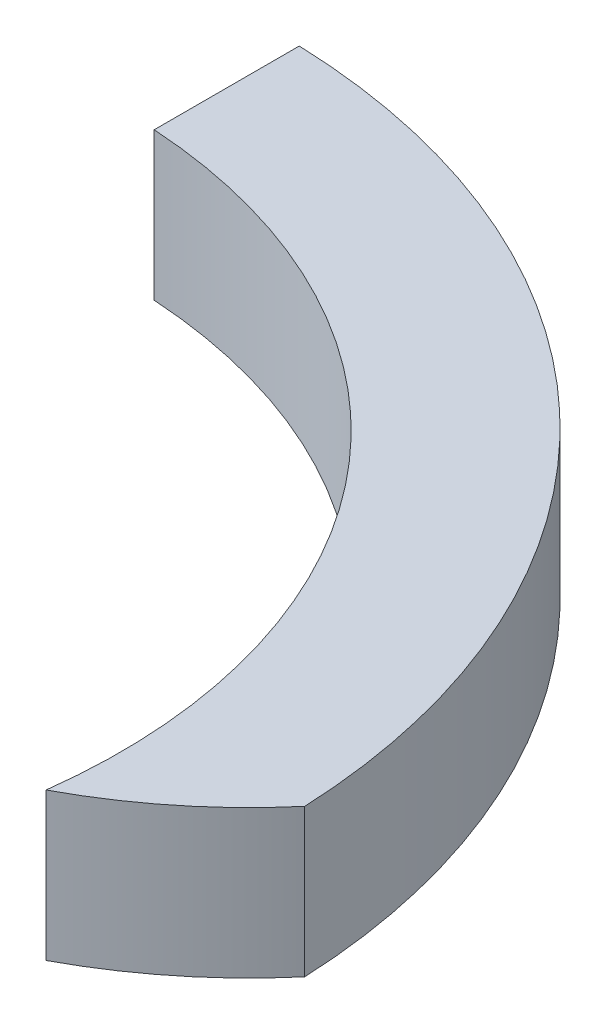
ISO-10303-21;
HEADER;
FILE_DESCRIPTION(('STEP AP214'),'2;1');
FILE_NAME('part.step','',(''),(''),'','','');
FILE_SCHEMA(('AUTOMOTIVE_DESIGN { 1 0 10303 214 1 1 1 1 }'));
ENDSEC;
DATA;
#1=APPLICATION_CONTEXT('core data for automotive mechanical design processes');
#2=APPLICATION_PROTOCOL_DEFINITION('international standard','automotive_design',2000,#1);
#3=PRODUCT_CONTEXT('',#1,'mechanical');
#4=PRODUCT('Part','Part','',(#3));
#5=PRODUCT_RELATED_PRODUCT_CATEGORY('part','',(#4));
#6=PRODUCT_DEFINITION_FORMATION('','',#4);
#7=PRODUCT_DEFINITION_CONTEXT('part definition',#1,'design');
#8=PRODUCT_DEFINITION('design','',#6,#7);
#9=PRODUCT_DEFINITION_SHAPE('','',#8);
#10=(LENGTH_UNIT() NAMED_UNIT(*) SI_UNIT(.MILLI.,.METRE.));
#11=(NAMED_UNIT(*) PLANE_ANGLE_UNIT() SI_UNIT($,.RADIAN.));
#12=(NAMED_UNIT(*) SI_UNIT($,.STERADIAN.) SOLID_ANGLE_UNIT());
#13=UNCERTAINTY_MEASURE_WITH_UNIT(LENGTH_MEASURE(1.E-05),#10,'distance_accuracy_value','');
#14=(GEOMETRIC_REPRESENTATION_CONTEXT(3) GLOBAL_UNCERTAINTY_ASSIGNED_CONTEXT((#13)) GLOBAL_UNIT_ASSIGNED_CONTEXT((#10,
#11,#12)) REPRESENTATION_CONTEXT('',''));
#15=CARTESIAN_POINT('',(0.,0.,0.));
#16=DIRECTION('',(0.,0.,1.));
#17=DIRECTION('',(1.,0.,0.));
#18=AXIS2_PLACEMENT_3D('',#15,#16,#17);
#19=CARTESIAN_POINT('',(86.487166974426,25.4,-86.7884043944306));
#20=DIRECTION('',(0.,1.,0.));
#21=DIRECTION('',(0.,0.,1.));
#22=AXIS2_PLACEMENT_3D('',#19,#20,#21);
#23=PLANE('',#22);
#24=CARTESIAN_POINT('',(18.985182842922,25.4,-43.2164154029401));
#25=DIRECTION('',(0.,1.,0.));
#26=DIRECTION('',(0.,0.,-1.));
#27=AXIS2_PLACEMENT_3D('',#24,#25,#26);
#28=CIRCLE('',#27,117.865599722059);
#29=CARTESIAN_POINT('',(136.744902109116,25.4,-48.2112243269925));
#30=VERTEX_POINT('',#29);
#31=CARTESIAN_POINT('',(23.0118290964539,25.4,-161.013213822038));
#32=VERTEX_POINT('',#31);
#33=EDGE_CURVE('E91',#30,#32,#28,.T.);
#34=ORIENTED_EDGE('',*,*,#33,.T.);
#35=DIRECTION('',(0.,0.,1.));
#36=VECTOR('',#35,1.);
#37=CARTESIAN_POINT('',(23.0118290964539,25.4,-86.7884043944306));
#38=LINE('',#37,#36);
#39=CARTESIAN_POINT('',(23.0118290964539,25.4,-136.058182001901));
#40=VERTEX_POINT('',#39);
#41=EDGE_CURVE('E43',#32,#40,#38,.T.);
#42=ORIENTED_EDGE('',*,*,#41,.T.);
#43=CARTESIAN_POINT('',(17.0299038346586,25.4,-40.4491483280348));
#44=DIRECTION('',(0.,1.,0.));
#45=DIRECTION('',(0.,0.,-1.));
#46=AXIS2_PLACEMENT_3D('',#43,#44,#45);
#47=CIRCLE('',#46,95.7959850405439);
#48=CARTESIAN_POINT('',(112.066438028889,25.4,-28.4105471536038));
#49=VERTEX_POINT('',#48);
#50=EDGE_CURVE('E94',#49,#40,#47,.T.);
#51=ORIENTED_EDGE('',*,*,#50,.F.);
#52=CARTESIAN_POINT('',(72.7034977064349,25.4,-102.749601262319));
#53=DIRECTION('',(0.,1.,0.));
#54=DIRECTION('',(0.,0.,1.));
#55=AXIS2_PLACEMENT_3D('',#52,#53,#54);
#56=CIRCLE('',#55,84.117394376);
#57=EDGE_CURVE('E59',#49,#30,#56,.T.);
#58=ORIENTED_EDGE('',*,*,#57,.T.);
#59=EDGE_LOOP('',(#34,#42,#51,#58));
#60=FACE_BOUND('',#59,.T.);
#61=ADVANCED_FACE('F39',(#60),#23,.T.);
#62=CARTESIAN_POINT('',(86.487166974426,0.,-86.7884043944306));
#63=DIRECTION('',(0.,1.,0.));
#64=DIRECTION('',(0.,0.,1.));
#65=AXIS2_PLACEMENT_3D('',#62,#63,#64);
#66=PLANE('',#65);
#67=DIRECTION('',(0.,0.,1.));
#68=VECTOR('',#67,1.);
#69=CARTESIAN_POINT('',(23.0118290964539,0.,-161.013213822038));
#70=LINE('',#69,#68);
#71=CARTESIAN_POINT('',(23.0118290964539,0.,-161.013213822038));
#72=VERTEX_POINT('',#71);
#73=CARTESIAN_POINT('',(23.0118290964539,0.,-136.058182001901));
#74=VERTEX_POINT('',#73);
#75=EDGE_CURVE('E96',#72,#74,#70,.T.);
#76=ORIENTED_EDGE('',*,*,#75,.F.);
#77=CARTESIAN_POINT('',(18.985182842922,0.,-43.2164154029401));
#78=DIRECTION('',(0.,1.,0.));
#79=DIRECTION('',(0.,0.,-1.));
#80=AXIS2_PLACEMENT_3D('',#77,#78,#79);
#81=CIRCLE('',#80,117.865599722059);
#82=CARTESIAN_POINT('',(136.744902109116,0.,-48.2112243269925));
#83=VERTEX_POINT('',#82);
#84=EDGE_CURVE('E99',#83,#72,#81,.T.);
#85=ORIENTED_EDGE('',*,*,#84,.F.);
#86=CARTESIAN_POINT('',(72.7034977064349,0.,-102.749601262319));
#87=DIRECTION('',(0.,1.,0.));
#88=DIRECTION('',(0.,0.,1.));
#89=AXIS2_PLACEMENT_3D('',#86,#87,#88);
#90=CIRCLE('',#89,84.117394376);
#91=CARTESIAN_POINT('',(112.066438028889,0.,-28.4105471536038));
#92=VERTEX_POINT('',#91);
#93=EDGE_CURVE('E83',#92,#83,#90,.T.);
#94=ORIENTED_EDGE('',*,*,#93,.F.);
#95=CARTESIAN_POINT('',(17.0299038346586,0.,-40.4491483280348));
#96=DIRECTION('',(0.,1.,0.));
#97=DIRECTION('',(0.,0.,-1.));
#98=AXIS2_PLACEMENT_3D('',#95,#96,#97);
#99=CIRCLE('',#98,95.7959850405439);
#100=EDGE_CURVE('E108',#92,#74,#99,.T.);
#101=ORIENTED_EDGE('',*,*,#100,.T.);
#102=EDGE_LOOP('',(#76,#85,#94,#101));
#103=FACE_BOUND('',#102,.T.);
#104=ADVANCED_FACE('F133',(#103),#66,.F.);
#105=CARTESIAN_POINT('',(18.985182842922,25.4,-43.2164154029401));
#106=DIRECTION('',(0.,-1.,0.));
#107=DIRECTION('',(0.,0.,-1.));
#108=AXIS2_PLACEMENT_3D('',#105,#106,#107);
#109=CYLINDRICAL_SURFACE('',#108,117.865599722059);
#110=ORIENTED_EDGE('',*,*,#84,.T.);
#111=DIRECTION('',(0.,-1.,0.));
#112=VECTOR('',#111,1.);
#113=CARTESIAN_POINT('',(23.0118290964539,25.4,-161.013213822038));
#114=LINE('',#113,#112);
#115=EDGE_CURVE('E50',#32,#72,#114,.T.);
#116=ORIENTED_EDGE('',*,*,#115,.F.);
#117=ORIENTED_EDGE('',*,*,#33,.F.);
#118=DIRECTION('',(0.,-1.,0.));
#119=VECTOR('',#118,1.);
#120=CARTESIAN_POINT('',(136.744902109116,25.4,-48.2112243269925));
#121=LINE('',#120,#119);
#122=EDGE_CURVE('E12',#30,#83,#121,.T.);
#123=ORIENTED_EDGE('',*,*,#122,.T.);
#124=EDGE_LOOP('',(#110,#116,#117,#123));
#125=FACE_BOUND('',#124,.T.);
#126=ADVANCED_FACE('F41',(#125),#109,.T.);
#127=CARTESIAN_POINT('',(17.0299038346586,25.4,-40.4491483280348));
#128=DIRECTION('',(0.,-1.,0.));
#129=DIRECTION('',(0.,0.,-1.));
#130=AXIS2_PLACEMENT_3D('',#127,#128,#129);
#131=CYLINDRICAL_SURFACE('',#130,95.7959850405439);
#132=ORIENTED_EDGE('',*,*,#100,.F.);
#133=DIRECTION('',(0.,-1.,0.));
#134=VECTOR('',#133,1.);
#135=CARTESIAN_POINT('',(112.066438028889,25.4,-28.4105471536038));
#136=LINE('',#135,#134);
#137=EDGE_CURVE('E79',#49,#92,#136,.T.);
#138=ORIENTED_EDGE('',*,*,#137,.F.);
#139=ORIENTED_EDGE('',*,*,#50,.T.);
#140=DIRECTION('',(0.,-1.,0.));
#141=VECTOR('',#140,1.);
#142=CARTESIAN_POINT('',(23.0118290964539,25.4,-136.058182001901));
#143=LINE('',#142,#141);
#144=EDGE_CURVE('E75',#40,#74,#143,.T.);
#145=ORIENTED_EDGE('',*,*,#144,.T.);
#146=EDGE_LOOP('',(#132,#138,#139,#145));
#147=FACE_BOUND('',#146,.T.);
#148=ADVANCED_FACE('F124',(#147),#131,.F.);
#149=CARTESIAN_POINT('',(23.0118290964539,0.,-161.013213822038));
#150=DIRECTION('',(-1.,0.,0.));
#151=DIRECTION('',(0.,0.,1.));
#152=AXIS2_PLACEMENT_3D('',#149,#150,#151);
#153=PLANE('',#152);
#154=ORIENTED_EDGE('',*,*,#115,.T.);
#155=ORIENTED_EDGE('',*,*,#75,.T.);
#156=ORIENTED_EDGE('',*,*,#144,.F.);
#157=ORIENTED_EDGE('',*,*,#41,.F.);
#158=EDGE_LOOP('',(#154,#155,#156,#157));
#159=FACE_BOUND('',#158,.T.);
#160=ADVANCED_FACE('F123',(#159),#153,.T.);
#161=CARTESIAN_POINT('',(72.7034977064349,0.,-102.749601262319));
#162=DIRECTION('',(0.,1.,0.));
#163=DIRECTION('',(0.,0.,1.));
#164=AXIS2_PLACEMENT_3D('',#161,#162,#163);
#165=CYLINDRICAL_SURFACE('',#164,84.117394376);
#166=ORIENTED_EDGE('',*,*,#137,.T.);
#167=ORIENTED_EDGE('',*,*,#93,.T.);
#168=ORIENTED_EDGE('',*,*,#122,.F.);
#169=ORIENTED_EDGE('',*,*,#57,.F.);
#170=EDGE_LOOP('',(#166,#167,#168,#169));
#171=FACE_BOUND('',#170,.T.);
#172=ADVANCED_FACE('F84',(#171),#165,.T.);
#173=CLOSED_SHELL('',(#61,#104,#126,#148,#160,#172));
#174=MANIFOLD_SOLID_BREP('B2',#173);
#175=ADVANCED_BREP_SHAPE_REPRESENTATION('',(#18,#174),#14);
#176=SHAPE_DEFINITION_REPRESENTATION(#9,#175);
ENDSEC;
END-ISO-10303-21;
